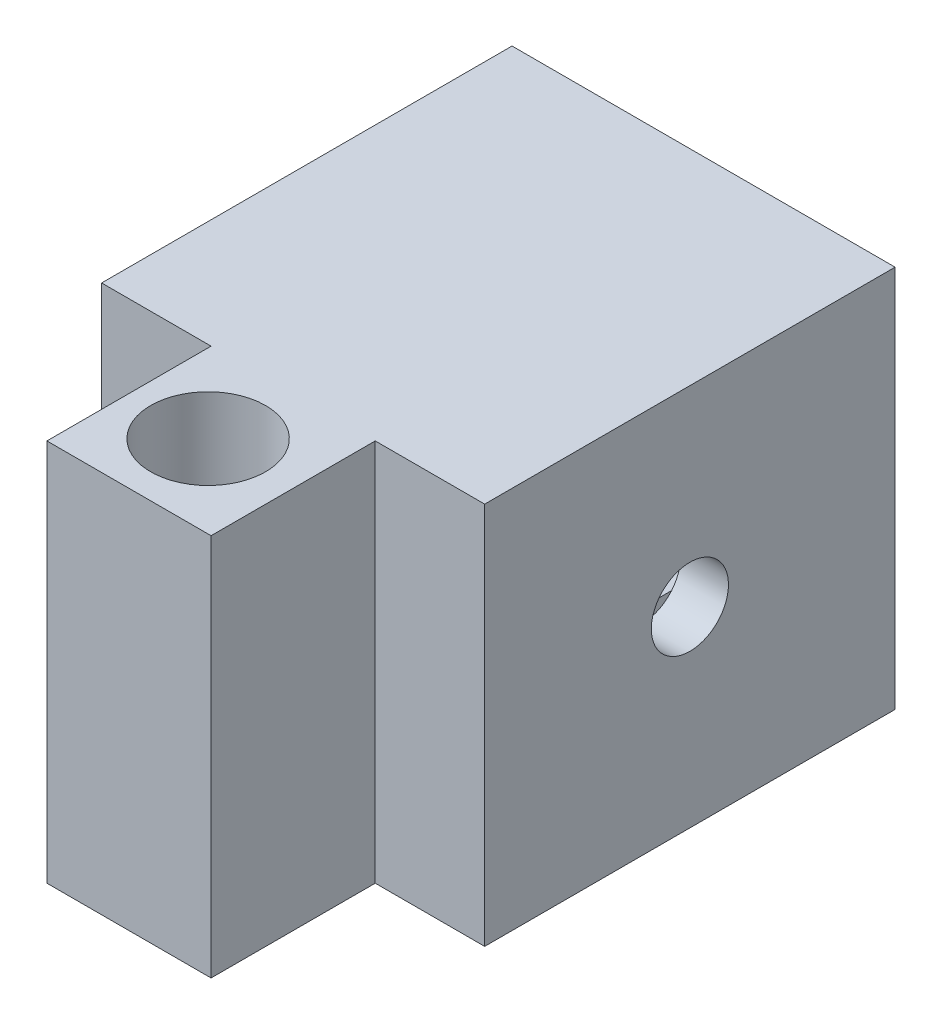
ISO-10303-21;
HEADER;
FILE_DESCRIPTION(('STEP AP214'),'2;1');
FILE_NAME('part.step','',(''),(''),'','','');
FILE_SCHEMA(('AUTOMOTIVE_DESIGN { 1 0 10303 214 1 1 1 1 }'));
ENDSEC;
DATA;
#1=APPLICATION_CONTEXT('core data for automotive mechanical design processes');
#2=APPLICATION_PROTOCOL_DEFINITION('international standard','automotive_design',2000,#1);
#3=PRODUCT_CONTEXT('',#1,'mechanical');
#4=PRODUCT('Part','Part','',(#3));
#5=PRODUCT_RELATED_PRODUCT_CATEGORY('part','',(#4));
#6=PRODUCT_DEFINITION_FORMATION('','',#4);
#7=PRODUCT_DEFINITION_CONTEXT('part definition',#1,'design');
#8=PRODUCT_DEFINITION('design','',#6,#7);
#9=PRODUCT_DEFINITION_SHAPE('','',#8);
#10=(LENGTH_UNIT() NAMED_UNIT(*) SI_UNIT(.MILLI.,.METRE.));
#11=(NAMED_UNIT(*) PLANE_ANGLE_UNIT() SI_UNIT($,.RADIAN.));
#12=(NAMED_UNIT(*) SI_UNIT($,.STERADIAN.) SOLID_ANGLE_UNIT());
#13=UNCERTAINTY_MEASURE_WITH_UNIT(LENGTH_MEASURE(1.E-05),#10,'distance_accuracy_value','');
#14=(GEOMETRIC_REPRESENTATION_CONTEXT(3) GLOBAL_UNCERTAINTY_ASSIGNED_CONTEXT((#13)) GLOBAL_UNIT_ASSIGNED_CONTEXT((#10,
#11,#12)) REPRESENTATION_CONTEXT('',''));
#15=CARTESIAN_POINT('',(0.,0.,0.));
#16=DIRECTION('',(0.,0.,1.));
#17=DIRECTION('',(1.,0.,0.));
#18=AXIS2_PLACEMENT_3D('',#15,#16,#17);
#19=CARTESIAN_POINT('',(0.,0.,0.));
#20=DIRECTION('',(0.,0.,1.));
#21=DIRECTION('',(1.,0.,0.));
#22=AXIS2_PLACEMENT_3D('',#19,#20,#21);
#23=PLANE('',#22);
#24=DIRECTION('',(1.,0.,0.));
#25=VECTOR('',#24,1.);
#26=CARTESIAN_POINT('',(0.,-14.,0.));
#27=LINE('',#26,#25);
#28=CARTESIAN_POINT('',(-14.,-14.,0.));
#29=VERTEX_POINT('',#28);
#30=CARTESIAN_POINT('',(-6.,-14.,0.));
#31=VERTEX_POINT('',#30);
#32=EDGE_CURVE('E69',#29,#31,#27,.T.);
#33=ORIENTED_EDGE('',*,*,#32,.T.);
#34=DIRECTION('',(0.,1.,0.));
#35=VECTOR('',#34,1.);
#36=CARTESIAN_POINT('',(-6.,-14.,0.));
#37=LINE('',#36,#35);
#38=CARTESIAN_POINT('',(-6.,14.,0.));
#39=VERTEX_POINT('',#38);
#40=EDGE_CURVE('E251',#31,#39,#37,.T.);
#41=ORIENTED_EDGE('',*,*,#40,.T.);
#42=DIRECTION('',(1.,0.,0.));
#43=VECTOR('',#42,1.);
#44=CARTESIAN_POINT('',(0.,14.,0.));
#45=LINE('',#44,#43);
#46=CARTESIAN_POINT('',(-14.,14.,0.));
#47=VERTEX_POINT('',#46);
#48=EDGE_CURVE('E302',#47,#39,#45,.T.);
#49=ORIENTED_EDGE('',*,*,#48,.F.);
#50=DIRECTION('',(0.,-1.,0.));
#51=VECTOR('',#50,1.);
#52=CARTESIAN_POINT('',(-14.,0.,0.));
#53=LINE('',#52,#51);
#54=EDGE_CURVE('E305',#47,#29,#53,.T.);
#55=ORIENTED_EDGE('',*,*,#54,.T.);
#56=EDGE_LOOP('',(#33,#41,#49,#55));
#57=FACE_BOUND('',#56,.T.);
#58=ADVANCED_FACE('F44',(#57),#23,.T.);
#59=CARTESIAN_POINT('',(-2.99327906455817,0.,-30.));
#60=DIRECTION('',(1.,0.,0.));
#61=DIRECTION('',(0.,1.,0.));
#62=AXIS2_PLACEMENT_3D('',#59,#60,#61);
#63=PLANE('',#62);
#64=DIRECTION('',(0.,1.,0.));
#65=VECTOR('',#64,1.);
#66=CARTESIAN_POINT('',(-2.99327906455817,0.,-5.));
#67=LINE('',#66,#65);
#68=CARTESIAN_POINT('',(-2.99327906455815,-10.5,-5.));
#69=VERTEX_POINT('',#68);
#70=CARTESIAN_POINT('',(-2.99327906455815,-8.8,-5.));
#71=VERTEX_POINT('',#70);
#72=EDGE_CURVE('E401',#69,#71,#67,.T.);
#73=ORIENTED_EDGE('',*,*,#72,.T.);
#74=DIRECTION('',(0.,0.,1.));
#75=VECTOR('',#74,1.);
#76=CARTESIAN_POINT('',(-2.99327906455815,-8.8,-30.));
#77=LINE('',#76,#75);
#78=CARTESIAN_POINT('',(-2.99327906455815,-8.8,-30.));
#79=VERTEX_POINT('',#78);
#80=EDGE_CURVE('E12',#79,#71,#77,.T.);
#81=ORIENTED_EDGE('',*,*,#80,.F.);
#82=DIRECTION('',(0.,1.,0.));
#83=VECTOR('',#82,1.);
#84=CARTESIAN_POINT('',(-2.99327906455817,0.,-30.));
#85=LINE('',#84,#83);
#86=CARTESIAN_POINT('',(-2.99327906455815,-10.5,-30.));
#87=VERTEX_POINT('',#86);
#88=EDGE_CURVE('E418',#87,#79,#85,.T.);
#89=ORIENTED_EDGE('',*,*,#88,.F.);
#90=DIRECTION('',(0.,0.,1.));
#91=VECTOR('',#90,1.);
#92=CARTESIAN_POINT('',(-2.99327906455815,-10.5,-30.));
#93=LINE('',#92,#91);
#94=EDGE_CURVE('E48',#87,#69,#93,.T.);
#95=ORIENTED_EDGE('',*,*,#94,.T.);
#96=EDGE_LOOP('',(#73,#81,#89,#95));
#97=FACE_BOUND('',#96,.T.);
#98=ADVANCED_FACE('F46',(#97),#63,.F.);
#99=CARTESIAN_POINT('',(0.,-8.8,-30.));
#100=DIRECTION('',(0.,1.,0.));
#101=DIRECTION('',(0.,0.,1.));
#102=AXIS2_PLACEMENT_3D('',#99,#100,#101);
#103=PLANE('',#102);
#104=DIRECTION('',(-1.,0.,0.));
#105=VECTOR('',#104,1.);
#106=CARTESIAN_POINT('',(0.,-8.8,-5.));
#107=LINE('',#106,#105);
#108=CARTESIAN_POINT('',(-4.4952478421969,-8.8,-5.));
#109=VERTEX_POINT('',#108);
#110=EDGE_CURVE('E404',#71,#109,#107,.T.);
#111=ORIENTED_EDGE('',*,*,#110,.T.);
#112=DIRECTION('',(0.,0.,1.));
#113=VECTOR('',#112,1.);
#114=CARTESIAN_POINT('',(-4.4952478421969,-8.8,-30.));
#115=LINE('',#114,#113);
#116=CARTESIAN_POINT('',(-4.4952478421969,-8.8,-30.));
#117=VERTEX_POINT('',#116);
#118=EDGE_CURVE('E53',#117,#109,#115,.T.);
#119=ORIENTED_EDGE('',*,*,#118,.F.);
#120=DIRECTION('',(-1.,0.,0.));
#121=VECTOR('',#120,1.);
#122=CARTESIAN_POINT('',(0.,-8.8,-30.));
#123=LINE('',#122,#121);
#124=EDGE_CURVE('E431',#79,#117,#123,.T.);
#125=ORIENTED_EDGE('',*,*,#124,.F.);
#126=ORIENTED_EDGE('',*,*,#80,.T.);
#127=EDGE_LOOP('',(#111,#119,#125,#126));
#128=FACE_BOUND('',#127,.T.);
#129=ADVANCED_FACE('F533',(#128),#103,.F.);
#130=CARTESIAN_POINT('',(-4.4952478421969,0.,-30.));
#131=DIRECTION('',(1.,0.,0.));
#132=DIRECTION('',(0.,0.,-1.));
#133=AXIS2_PLACEMENT_3D('',#130,#131,#132);
#134=PLANE('',#133);
#135=DIRECTION('',(0.,1.,0.));
#136=VECTOR('',#135,1.);
#137=CARTESIAN_POINT('',(-4.4952478421969,0.,-5.));
#138=LINE('',#137,#136);
#139=CARTESIAN_POINT('',(-4.4952478421969,-7.79987160701187,-5.));
#140=VERTEX_POINT('',#139);
#141=EDGE_CURVE('E406',#109,#140,#138,.T.);
#142=ORIENTED_EDGE('',*,*,#141,.T.);
#143=DIRECTION('',(0.,0.,1.));
#144=VECTOR('',#143,1.);
#145=CARTESIAN_POINT('',(-4.4952478421969,-7.79987160701187,-30.));
#146=LINE('',#145,#144);
#147=CARTESIAN_POINT('',(-4.4952478421969,-7.79987160701187,-30.));
#148=VERTEX_POINT('',#147);
#149=EDGE_CURVE('E435',#148,#140,#146,.T.);
#150=ORIENTED_EDGE('',*,*,#149,.F.);
#151=DIRECTION('',(0.,1.,0.));
#152=VECTOR('',#151,1.);
#153=CARTESIAN_POINT('',(-4.4952478421969,0.,-30.));
#154=LINE('',#153,#152);
#155=EDGE_CURVE('E429',#117,#148,#154,.T.);
#156=ORIENTED_EDGE('',*,*,#155,.F.);
#157=ORIENTED_EDGE('',*,*,#118,.T.);
#158=EDGE_LOOP('',(#142,#150,#156,#157));
#159=FACE_BOUND('',#158,.T.);
#160=ADVANCED_FACE('F530',(#159),#134,.F.);
#161=CARTESIAN_POINT('',(0.,-7.79987160701187,-30.));
#162=DIRECTION('',(0.,-1.,0.));
#163=DIRECTION('',(1.,0.,0.));
#164=AXIS2_PLACEMENT_3D('',#161,#162,#163);
#165=PLANE('',#164);
#166=DIRECTION('',(1.,0.,0.));
#167=VECTOR('',#166,1.);
#168=CARTESIAN_POINT('',(0.,-7.79987160701187,-5.));
#169=LINE('',#168,#167);
#170=CARTESIAN_POINT('',(4.50555441396361,-7.79987160701187,-5.));
#171=VERTEX_POINT('',#170);
#172=EDGE_CURVE('E408',#140,#171,#169,.T.);
#173=ORIENTED_EDGE('',*,*,#172,.T.);
#174=DIRECTION('',(0.,0.,1.));
#175=VECTOR('',#174,1.);
#176=CARTESIAN_POINT('',(4.50555441396361,-7.79987160701187,-30.));
#177=LINE('',#176,#175);
#178=CARTESIAN_POINT('',(4.50555441396361,-7.79987160701187,-30.));
#179=VERTEX_POINT('',#178);
#180=EDGE_CURVE('E438',#179,#171,#177,.T.);
#181=ORIENTED_EDGE('',*,*,#180,.F.);
#182=DIRECTION('',(1.,0.,0.));
#183=VECTOR('',#182,1.);
#184=CARTESIAN_POINT('',(0.,-7.79987160701187,-30.));
#185=LINE('',#184,#183);
#186=EDGE_CURVE('E427',#148,#179,#185,.T.);
#187=ORIENTED_EDGE('',*,*,#186,.F.);
#188=ORIENTED_EDGE('',*,*,#149,.T.);
#189=EDGE_LOOP('',(#173,#181,#187,#188));
#190=FACE_BOUND('',#189,.T.);
#191=ADVANCED_FACE('F525',(#190),#165,.F.);
#192=CARTESIAN_POINT('',(4.50555441396358,0.,-30.));
#193=DIRECTION('',(-1.,0.,0.));
#194=DIRECTION('',(0.,-1.,0.));
#195=AXIS2_PLACEMENT_3D('',#192,#193,#194);
#196=PLANE('',#195);
#197=DIRECTION('',(0.,-1.,0.));
#198=VECTOR('',#197,1.);
#199=CARTESIAN_POINT('',(4.50555441396358,0.,-5.));
#200=LINE('',#199,#198);
#201=CARTESIAN_POINT('',(4.50555441396361,-8.8,-5.));
#202=VERTEX_POINT('',#201);
#203=EDGE_CURVE('E410',#171,#202,#200,.T.);
#204=ORIENTED_EDGE('',*,*,#203,.T.);
#205=DIRECTION('',(0.,0.,1.));
#206=VECTOR('',#205,1.);
#207=CARTESIAN_POINT('',(4.50555441396361,-8.8,-30.));
#208=LINE('',#207,#206);
#209=CARTESIAN_POINT('',(4.50555441396361,-8.8,-30.));
#210=VERTEX_POINT('',#209);
#211=EDGE_CURVE('E441',#210,#202,#208,.T.);
#212=ORIENTED_EDGE('',*,*,#211,.F.);
#213=DIRECTION('',(0.,-1.,0.));
#214=VECTOR('',#213,1.);
#215=CARTESIAN_POINT('',(4.50555441396358,0.,-30.));
#216=LINE('',#215,#214);
#217=EDGE_CURVE('E425',#179,#210,#216,.T.);
#218=ORIENTED_EDGE('',*,*,#217,.F.);
#219=ORIENTED_EDGE('',*,*,#180,.T.);
#220=EDGE_LOOP('',(#204,#212,#218,#219));
#221=FACE_BOUND('',#220,.T.);
#222=ADVANCED_FACE('F521',(#221),#196,.F.);
#223=CARTESIAN_POINT('',(0.,-8.80000000000001,-30.));
#224=DIRECTION('',(0.,1.,0.));
#225=DIRECTION('',(-1.,0.,0.));
#226=AXIS2_PLACEMENT_3D('',#223,#224,#225);
#227=PLANE('',#226);
#228=DIRECTION('',(-1.,0.,0.));
#229=VECTOR('',#228,1.);
#230=CARTESIAN_POINT('',(0.,-8.80000000000001,-5.));
#231=LINE('',#230,#229);
#232=CARTESIAN_POINT('',(2.90672093544185,-8.8,-5.));
#233=VERTEX_POINT('',#232);
#234=EDGE_CURVE('E412',#202,#233,#231,.T.);
#235=ORIENTED_EDGE('',*,*,#234,.T.);
#236=DIRECTION('',(0.,0.,1.));
#237=VECTOR('',#236,1.);
#238=CARTESIAN_POINT('',(2.90672093544185,-8.8,-30.));
#239=LINE('',#238,#237);
#240=CARTESIAN_POINT('',(2.90672093544185,-8.8,-30.));
#241=VERTEX_POINT('',#240);
#242=EDGE_CURVE('E444',#241,#233,#239,.T.);
#243=ORIENTED_EDGE('',*,*,#242,.F.);
#244=DIRECTION('',(-1.,0.,0.));
#245=VECTOR('',#244,1.);
#246=CARTESIAN_POINT('',(0.,-8.80000000000001,-30.));
#247=LINE('',#246,#245);
#248=EDGE_CURVE('E423',#210,#241,#247,.T.);
#249=ORIENTED_EDGE('',*,*,#248,.F.);
#250=ORIENTED_EDGE('',*,*,#211,.T.);
#251=EDGE_LOOP('',(#235,#243,#249,#250));
#252=FACE_BOUND('',#251,.T.);
#253=ADVANCED_FACE('F517',(#252),#227,.F.);
#254=CARTESIAN_POINT('',(2.90672093544185,0.,-30.));
#255=DIRECTION('',(-1.,0.,0.));
#256=DIRECTION('',(0.,-1.,0.));
#257=AXIS2_PLACEMENT_3D('',#254,#255,#256);
#258=PLANE('',#257);
#259=DIRECTION('',(0.,-1.,0.));
#260=VECTOR('',#259,1.);
#261=CARTESIAN_POINT('',(2.90672093544185,0.,-5.));
#262=LINE('',#261,#260);
#263=CARTESIAN_POINT('',(2.90672093544185,-10.5,-5.));
#264=VERTEX_POINT('',#263);
#265=EDGE_CURVE('E414',#233,#264,#262,.T.);
#266=ORIENTED_EDGE('',*,*,#265,.T.);
#267=DIRECTION('',(0.,0.,1.));
#268=VECTOR('',#267,1.);
#269=CARTESIAN_POINT('',(2.90672093544185,-10.5,-30.));
#270=LINE('',#269,#268);
#271=CARTESIAN_POINT('',(2.90672093544185,-10.5,-30.));
#272=VERTEX_POINT('',#271);
#273=EDGE_CURVE('E446',#272,#264,#270,.T.);
#274=ORIENTED_EDGE('',*,*,#273,.F.);
#275=DIRECTION('',(0.,-1.,0.));
#276=VECTOR('',#275,1.);
#277=CARTESIAN_POINT('',(2.90672093544185,0.,-30.));
#278=LINE('',#277,#276);
#279=EDGE_CURVE('E421',#241,#272,#278,.T.);
#280=ORIENTED_EDGE('',*,*,#279,.F.);
#281=ORIENTED_EDGE('',*,*,#242,.T.);
#282=EDGE_LOOP('',(#266,#274,#280,#281));
#283=FACE_BOUND('',#282,.T.);
#284=ADVANCED_FACE('F512',(#283),#258,.F.);
#285=CARTESIAN_POINT('',(0.,0.,-30.));
#286=DIRECTION('',(0.,0.,1.));
#287=DIRECTION('',(1.,0.,0.));
#288=AXIS2_PLACEMENT_3D('',#285,#286,#287);
#289=PLANE('',#288);
#290=ORIENTED_EDGE('',*,*,#88,.T.);
#291=ORIENTED_EDGE('',*,*,#124,.T.);
#292=ORIENTED_EDGE('',*,*,#155,.T.);
#293=ORIENTED_EDGE('',*,*,#186,.T.);
#294=ORIENTED_EDGE('',*,*,#217,.T.);
#295=ORIENTED_EDGE('',*,*,#248,.T.);
#296=ORIENTED_EDGE('',*,*,#279,.T.);
#297=DIRECTION('',(-1.,0.,0.));
#298=VECTOR('',#297,1.);
#299=CARTESIAN_POINT('',(0.,-10.5,-30.));
#300=LINE('',#299,#298);
#301=CARTESIAN_POINT('',(10.5,-10.5,-30.));
#302=VERTEX_POINT('',#301);
#303=EDGE_CURVE('E295',#302,#272,#300,.T.);
#304=ORIENTED_EDGE('',*,*,#303,.F.);
#305=DIRECTION('',(0.,-1.,0.));
#306=VECTOR('',#305,1.);
#307=CARTESIAN_POINT('',(10.5,0.,-30.));
#308=LINE('',#307,#306);
#309=CARTESIAN_POINT('',(10.5,10.5,-30.));
#310=VERTEX_POINT('',#309);
#311=EDGE_CURVE('E291',#310,#302,#308,.T.);
#312=ORIENTED_EDGE('',*,*,#311,.F.);
#313=DIRECTION('',(-1.,0.,0.));
#314=VECTOR('',#313,1.);
#315=CARTESIAN_POINT('',(0.,10.5,-30.));
#316=LINE('',#315,#314);
#317=CARTESIAN_POINT('',(2.90672093544185,10.5,-30.));
#318=VERTEX_POINT('',#317);
#319=EDGE_CURVE('E288',#310,#318,#316,.T.);
#320=ORIENTED_EDGE('',*,*,#319,.T.);
#321=DIRECTION('',(0.,1.,0.));
#322=VECTOR('',#321,1.);
#323=CARTESIAN_POINT('',(2.90672093544185,0.,-30.));
#324=LINE('',#323,#322);
#325=CARTESIAN_POINT('',(2.90672093544185,8.8,-30.));
#326=VERTEX_POINT('',#325);
#327=EDGE_CURVE('E331',#326,#318,#324,.T.);
#328=ORIENTED_EDGE('',*,*,#327,.F.);
#329=DIRECTION('',(-1.,0.,0.));
#330=VECTOR('',#329,1.);
#331=CARTESIAN_POINT('',(0.,8.8,-30.));
#332=LINE('',#331,#330);
#333=CARTESIAN_POINT('',(4.50555441396361,8.8,-30.));
#334=VERTEX_POINT('',#333);
#335=EDGE_CURVE('E311',#334,#326,#332,.T.);
#336=ORIENTED_EDGE('',*,*,#335,.F.);
#337=DIRECTION('',(0.,1.,0.));
#338=VECTOR('',#337,1.);
#339=CARTESIAN_POINT('',(4.50555441396358,0.,-30.));
#340=LINE('',#339,#338);
#341=CARTESIAN_POINT('',(4.50555441396361,7.79987160701187,-30.));
#342=VERTEX_POINT('',#341);
#343=EDGE_CURVE('E345',#342,#334,#340,.T.);
#344=ORIENTED_EDGE('',*,*,#343,.F.);
#345=DIRECTION('',(1.,0.,0.));
#346=VECTOR('',#345,1.);
#347=CARTESIAN_POINT('',(0.,7.79987160701187,-30.));
#348=LINE('',#347,#346);
#349=CARTESIAN_POINT('',(-4.4952478421969,7.79987160701187,-30.));
#350=VERTEX_POINT('',#349);
#351=EDGE_CURVE('E342',#350,#342,#348,.T.);
#352=ORIENTED_EDGE('',*,*,#351,.F.);
#353=DIRECTION('',(0.,-1.,0.));
#354=VECTOR('',#353,1.);
#355=CARTESIAN_POINT('',(-4.4952478421969,0.,-30.));
#356=LINE('',#355,#354);
#357=CARTESIAN_POINT('',(-4.4952478421969,8.8,-30.));
#358=VERTEX_POINT('',#357);
#359=EDGE_CURVE('E339',#358,#350,#356,.T.);
#360=ORIENTED_EDGE('',*,*,#359,.F.);
#361=DIRECTION('',(-1.,0.,0.));
#362=VECTOR('',#361,1.);
#363=CARTESIAN_POINT('',(0.,8.8,-30.));
#364=LINE('',#363,#362);
#365=CARTESIAN_POINT('',(-2.99327906455815,8.8,-30.));
#366=VERTEX_POINT('',#365);
#367=EDGE_CURVE('E336',#366,#358,#364,.T.);
#368=ORIENTED_EDGE('',*,*,#367,.F.);
#369=DIRECTION('',(0.,-1.,0.));
#370=VECTOR('',#369,1.);
#371=CARTESIAN_POINT('',(-2.99327906455815,0.,-30.));
#372=LINE('',#371,#370);
#373=CARTESIAN_POINT('',(-2.99327906455815,10.5,-30.));
#374=VERTEX_POINT('',#373);
#375=EDGE_CURVE('E333',#374,#366,#372,.T.);
#376=ORIENTED_EDGE('',*,*,#375,.F.);
#377=CARTESIAN_POINT('',(-10.5,10.5,-30.));
#378=VERTEX_POINT('',#377);
#379=EDGE_CURVE('E287',#374,#378,#316,.T.);
#380=ORIENTED_EDGE('',*,*,#379,.T.);
#381=DIRECTION('',(0.,-1.,0.));
#382=VECTOR('',#381,1.);
#383=CARTESIAN_POINT('',(-10.5,0.,-30.));
#384=LINE('',#383,#382);
#385=CARTESIAN_POINT('',(-10.5,-10.5,-30.));
#386=VERTEX_POINT('',#385);
#387=EDGE_CURVE('E284',#378,#386,#384,.T.);
#388=ORIENTED_EDGE('',*,*,#387,.T.);
#389=EDGE_CURVE('E294',#87,#386,#300,.T.);
#390=ORIENTED_EDGE('',*,*,#389,.F.);
#391=EDGE_LOOP('',(#290,#291,#292,#293,#294,#295,#296,#304,#312,#320,#328,#336,#344,#352,#360,
#368,#376,#380,#388,#390));
#392=FACE_BOUND('',#391,.T.);
#393=DIRECTION('',(0.,-1.,0.));
#394=VECTOR('',#393,1.);
#395=CARTESIAN_POINT('',(14.,0.,-30.));
#396=LINE('',#395,#394);
#397=CARTESIAN_POINT('',(14.,14.,-30.));
#398=VERTEX_POINT('',#397);
#399=CARTESIAN_POINT('',(14.,-14.,-30.));
#400=VERTEX_POINT('',#399);
#401=EDGE_CURVE('E274',#398,#400,#396,.T.);
#402=ORIENTED_EDGE('',*,*,#401,.T.);
#403=DIRECTION('',(1.,0.,0.));
#404=VECTOR('',#403,1.);
#405=CARTESIAN_POINT('',(0.,-14.,-30.));
#406=LINE('',#405,#404);
#407=CARTESIAN_POINT('',(-14.,-14.,-30.));
#408=VERTEX_POINT('',#407);
#409=EDGE_CURVE('E281',#408,#400,#406,.T.);
#410=ORIENTED_EDGE('',*,*,#409,.F.);
#411=DIRECTION('',(0.,-1.,0.));
#412=VECTOR('',#411,1.);
#413=CARTESIAN_POINT('',(-14.,0.,-30.));
#414=LINE('',#413,#412);
#415=CARTESIAN_POINT('',(-14.,14.,-30.));
#416=VERTEX_POINT('',#415);
#417=EDGE_CURVE('E278',#416,#408,#414,.T.);
#418=ORIENTED_EDGE('',*,*,#417,.F.);
#419=DIRECTION('',(1.,0.,0.));
#420=VECTOR('',#419,1.);
#421=CARTESIAN_POINT('',(0.,14.,-30.));
#422=LINE('',#421,#420);
#423=EDGE_CURVE('E276',#416,#398,#422,.T.);
#424=ORIENTED_EDGE('',*,*,#423,.T.);
#425=EDGE_LOOP('',(#402,#410,#418,#424));
#426=FACE_BOUND('',#425,.T.);
#427=ADVANCED_FACE('F483',(#392,#426),#289,.F.);
#428=CARTESIAN_POINT('',(0.,0.,-5.));
#429=DIRECTION('',(0.,0.,1.));
#430=DIRECTION('',(1.,0.,0.));
#431=AXIS2_PLACEMENT_3D('',#428,#429,#430);
#432=PLANE('',#431);
#433=DIRECTION('',(0.,1.,0.));
#434=VECTOR('',#433,1.);
#435=CARTESIAN_POINT('',(2.90672093544185,0.,-5.));
#436=LINE('',#435,#434);
#437=CARTESIAN_POINT('',(2.90672093544185,8.8,-5.));
#438=VERTEX_POINT('',#437);
#439=CARTESIAN_POINT('',(2.90672093544185,10.5,-5.));
#440=VERTEX_POINT('',#439);
#441=EDGE_CURVE('E352',#438,#440,#436,.T.);
#442=ORIENTED_EDGE('',*,*,#441,.T.);
#443=DIRECTION('',(-1.,0.,0.));
#444=VECTOR('',#443,1.);
#445=CARTESIAN_POINT('',(0.,10.5,-5.));
#446=LINE('',#445,#444);
#447=CARTESIAN_POINT('',(10.5,10.5,-5.));
#448=VERTEX_POINT('',#447);
#449=EDGE_CURVE('E396',#448,#440,#446,.T.);
#450=ORIENTED_EDGE('',*,*,#449,.F.);
#451=DIRECTION('',(0.,-1.,0.));
#452=VECTOR('',#451,1.);
#453=CARTESIAN_POINT('',(10.5,0.,-5.));
#454=LINE('',#453,#452);
#455=CARTESIAN_POINT('',(10.5,-10.5,-5.));
#456=VERTEX_POINT('',#455);
#457=EDGE_CURVE('E416',#448,#456,#454,.T.);
#458=ORIENTED_EDGE('',*,*,#457,.T.);
#459=DIRECTION('',(-1.,0.,0.));
#460=VECTOR('',#459,1.);
#461=CARTESIAN_POINT('',(0.,-10.5,-5.));
#462=LINE('',#461,#460);
#463=EDGE_CURVE('E402',#456,#264,#462,.T.);
#464=ORIENTED_EDGE('',*,*,#463,.T.);
#465=ORIENTED_EDGE('',*,*,#265,.F.);
#466=ORIENTED_EDGE('',*,*,#234,.F.);
#467=ORIENTED_EDGE('',*,*,#203,.F.);
#468=ORIENTED_EDGE('',*,*,#172,.F.);
#469=ORIENTED_EDGE('',*,*,#141,.F.);
#470=ORIENTED_EDGE('',*,*,#110,.F.);
#471=ORIENTED_EDGE('',*,*,#72,.F.);
#472=CARTESIAN_POINT('',(-10.5,-10.5,-5.));
#473=VERTEX_POINT('',#472);
#474=EDGE_CURVE('E399',#69,#473,#462,.T.);
#475=ORIENTED_EDGE('',*,*,#474,.T.);
#476=DIRECTION('',(0.,-1.,0.));
#477=VECTOR('',#476,1.);
#478=CARTESIAN_POINT('',(-10.5,0.,-5.));
#479=LINE('',#478,#477);
#480=CARTESIAN_POINT('',(-10.5,10.5,-5.));
#481=VERTEX_POINT('',#480);
#482=EDGE_CURVE('E395',#481,#473,#479,.T.);
#483=ORIENTED_EDGE('',*,*,#482,.F.);
#484=CARTESIAN_POINT('',(-2.99327906455815,10.5,-5.));
#485=VERTEX_POINT('',#484);
#486=EDGE_CURVE('E392',#485,#481,#446,.T.);
#487=ORIENTED_EDGE('',*,*,#486,.F.);
#488=DIRECTION('',(0.,-1.,0.));
#489=VECTOR('',#488,1.);
#490=CARTESIAN_POINT('',(-2.99327906455815,0.,-5.));
#491=LINE('',#490,#489);
#492=CARTESIAN_POINT('',(-2.99327906455815,8.8,-5.));
#493=VERTEX_POINT('',#492);
#494=EDGE_CURVE('E389',#485,#493,#491,.T.);
#495=ORIENTED_EDGE('',*,*,#494,.T.);
#496=DIRECTION('',(-1.,0.,0.));
#497=VECTOR('',#496,1.);
#498=CARTESIAN_POINT('',(0.,8.8,-5.));
#499=LINE('',#498,#497);
#500=CARTESIAN_POINT('',(-4.4952478421969,8.8,-5.));
#501=VERTEX_POINT('',#500);
#502=EDGE_CURVE('E386',#493,#501,#499,.T.);
#503=ORIENTED_EDGE('',*,*,#502,.T.);
#504=DIRECTION('',(0.,-1.,0.));
#505=VECTOR('',#504,1.);
#506=CARTESIAN_POINT('',(-4.4952478421969,0.,-5.));
#507=LINE('',#506,#505);
#508=CARTESIAN_POINT('',(-4.4952478421969,7.79987160701187,-5.));
#509=VERTEX_POINT('',#508);
#510=EDGE_CURVE('E383',#501,#509,#507,.T.);
#511=ORIENTED_EDGE('',*,*,#510,.T.);
#512=DIRECTION('',(1.,0.,0.));
#513=VECTOR('',#512,1.);
#514=CARTESIAN_POINT('',(0.,7.79987160701187,-5.));
#515=LINE('',#514,#513);
#516=CARTESIAN_POINT('',(4.50555441396361,7.79987160701187,-5.));
#517=VERTEX_POINT('',#516);
#518=EDGE_CURVE('E380',#509,#517,#515,.T.);
#519=ORIENTED_EDGE('',*,*,#518,.T.);
#520=DIRECTION('',(0.,1.,0.));
#521=VECTOR('',#520,1.);
#522=CARTESIAN_POINT('',(4.50555441396358,0.,-5.));
#523=LINE('',#522,#521);
#524=CARTESIAN_POINT('',(4.50555441396361,8.8,-5.));
#525=VERTEX_POINT('',#524);
#526=EDGE_CURVE('E377',#517,#525,#523,.T.);
#527=ORIENTED_EDGE('',*,*,#526,.T.);
#528=DIRECTION('',(-1.,0.,0.));
#529=VECTOR('',#528,1.);
#530=CARTESIAN_POINT('',(0.,8.8,-5.));
#531=LINE('',#530,#529);
#532=EDGE_CURVE('E374',#525,#438,#531,.T.);
#533=ORIENTED_EDGE('',*,*,#532,.T.);
#534=EDGE_LOOP('',(#442,#450,#458,#464,#465,#466,#467,#468,#469,#470,#471,#475,#483,#487,#495,
#503,#511,#519,#527,#533));
#535=FACE_BOUND('',#534,.T.);
#536=ADVANCED_FACE('F460',(#535),#432,.F.);
#537=CARTESIAN_POINT('',(0.,8.8,-30.));
#538=DIRECTION('',(0.,1.,0.));
#539=DIRECTION('',(0.,0.,1.));
#540=AXIS2_PLACEMENT_3D('',#537,#538,#539);
#541=PLANE('',#540);
#542=ORIENTED_EDGE('',*,*,#532,.F.);
#543=DIRECTION('',(0.,0.,1.));
#544=VECTOR('',#543,1.);
#545=CARTESIAN_POINT('',(4.50555441396361,8.8,-30.));
#546=LINE('',#545,#544);
#547=EDGE_CURVE('E349',#334,#525,#546,.T.);
#548=ORIENTED_EDGE('',*,*,#547,.F.);
#549=ORIENTED_EDGE('',*,*,#335,.T.);
#550=DIRECTION('',(0.,0.,1.));
#551=VECTOR('',#550,1.);
#552=CARTESIAN_POINT('',(2.90672093544185,8.8,-30.));
#553=LINE('',#552,#551);
#554=EDGE_CURVE('E348',#326,#438,#553,.T.);
#555=ORIENTED_EDGE('',*,*,#554,.T.);
#556=EDGE_LOOP('',(#542,#548,#549,#555));
#557=FACE_BOUND('',#556,.T.);
#558=ADVANCED_FACE('F492',(#557),#541,.T.);
#559=CARTESIAN_POINT('',(4.50555441396358,0.,-30.));
#560=DIRECTION('',(1.,0.,0.));
#561=DIRECTION('',(0.,1.,0.));
#562=AXIS2_PLACEMENT_3D('',#559,#560,#561);
#563=PLANE('',#562);
#564=ORIENTED_EDGE('',*,*,#526,.F.);
#565=DIRECTION('',(0.,0.,1.));
#566=VECTOR('',#565,1.);
#567=CARTESIAN_POINT('',(4.50555441396361,7.79987160701187,-30.));
#568=LINE('',#567,#566);
#569=EDGE_CURVE('E353',#342,#517,#568,.T.);
#570=ORIENTED_EDGE('',*,*,#569,.F.);
#571=ORIENTED_EDGE('',*,*,#343,.T.);
#572=ORIENTED_EDGE('',*,*,#547,.T.);
#573=EDGE_LOOP('',(#564,#570,#571,#572));
#574=FACE_BOUND('',#573,.T.);
#575=ADVANCED_FACE('F490',(#574),#563,.T.);
#576=CARTESIAN_POINT('',(0.,7.79987160701187,-30.));
#577=DIRECTION('',(0.,-1.,0.));
#578=DIRECTION('',(0.,0.,-1.));
#579=AXIS2_PLACEMENT_3D('',#576,#577,#578);
#580=PLANE('',#579);
#581=ORIENTED_EDGE('',*,*,#518,.F.);
#582=DIRECTION('',(0.,0.,1.));
#583=VECTOR('',#582,1.);
#584=CARTESIAN_POINT('',(-4.4952478421969,7.79987160701187,-30.));
#585=LINE('',#584,#583);
#586=EDGE_CURVE('E356',#350,#509,#585,.T.);
#587=ORIENTED_EDGE('',*,*,#586,.F.);
#588=ORIENTED_EDGE('',*,*,#351,.T.);
#589=ORIENTED_EDGE('',*,*,#569,.T.);
#590=EDGE_LOOP('',(#581,#587,#588,#589));
#591=FACE_BOUND('',#590,.T.);
#592=ADVANCED_FACE('F488',(#591),#580,.T.);
#593=CARTESIAN_POINT('',(-4.4952478421969,0.,-30.));
#594=DIRECTION('',(-1.,0.,0.));
#595=DIRECTION('',(0.,0.,1.));
#596=AXIS2_PLACEMENT_3D('',#593,#594,#595);
#597=PLANE('',#596);
#598=ORIENTED_EDGE('',*,*,#510,.F.);
#599=DIRECTION('',(0.,0.,1.));
#600=VECTOR('',#599,1.);
#601=CARTESIAN_POINT('',(-4.4952478421969,8.8,-30.));
#602=LINE('',#601,#600);
#603=EDGE_CURVE('E359',#358,#501,#602,.T.);
#604=ORIENTED_EDGE('',*,*,#603,.F.);
#605=ORIENTED_EDGE('',*,*,#359,.T.);
#606=ORIENTED_EDGE('',*,*,#586,.T.);
#607=EDGE_LOOP('',(#598,#604,#605,#606));
#608=FACE_BOUND('',#607,.T.);
#609=ADVANCED_FACE('F480',(#608),#597,.T.);
#610=CARTESIAN_POINT('',(0.,8.8,-30.));
#611=DIRECTION('',(0.,1.,0.));
#612=DIRECTION('',(0.,0.,1.));
#613=AXIS2_PLACEMENT_3D('',#610,#611,#612);
#614=PLANE('',#613);
#615=ORIENTED_EDGE('',*,*,#502,.F.);
#616=DIRECTION('',(0.,0.,1.));
#617=VECTOR('',#616,1.);
#618=CARTESIAN_POINT('',(-2.99327906455815,8.8,-30.));
#619=LINE('',#618,#617);
#620=EDGE_CURVE('E362',#366,#493,#619,.T.);
#621=ORIENTED_EDGE('',*,*,#620,.F.);
#622=ORIENTED_EDGE('',*,*,#367,.T.);
#623=ORIENTED_EDGE('',*,*,#603,.T.);
#624=EDGE_LOOP('',(#615,#621,#622,#623));
#625=FACE_BOUND('',#624,.T.);
#626=ADVANCED_FACE('F476',(#625),#614,.T.);
#627=CARTESIAN_POINT('',(-2.99327906455815,0.,-30.));
#628=DIRECTION('',(-1.,0.,0.));
#629=DIRECTION('',(0.,0.,1.));
#630=AXIS2_PLACEMENT_3D('',#627,#628,#629);
#631=PLANE('',#630);
#632=ORIENTED_EDGE('',*,*,#494,.F.);
#633=DIRECTION('',(0.,0.,1.));
#634=VECTOR('',#633,1.);
#635=CARTESIAN_POINT('',(-2.99327906455815,10.5,-30.));
#636=LINE('',#635,#634);
#637=EDGE_CURVE('E365',#374,#485,#636,.T.);
#638=ORIENTED_EDGE('',*,*,#637,.F.);
#639=ORIENTED_EDGE('',*,*,#375,.T.);
#640=ORIENTED_EDGE('',*,*,#620,.T.);
#641=EDGE_LOOP('',(#632,#638,#639,#640));
#642=FACE_BOUND('',#641,.T.);
#643=ADVANCED_FACE('F474',(#642),#631,.T.);
#644=CARTESIAN_POINT('',(2.90672093544185,0.,-30.));
#645=DIRECTION('',(1.,0.,0.));
#646=DIRECTION('',(0.,0.,-1.));
#647=AXIS2_PLACEMENT_3D('',#644,#645,#646);
#648=PLANE('',#647);
#649=ORIENTED_EDGE('',*,*,#441,.F.);
#650=ORIENTED_EDGE('',*,*,#554,.F.);
#651=ORIENTED_EDGE('',*,*,#327,.T.);
#652=DIRECTION('',(0.,0.,1.));
#653=VECTOR('',#652,1.);
#654=CARTESIAN_POINT('',(2.90672093544185,10.5,-30.));
#655=LINE('',#654,#653);
#656=EDGE_CURVE('E368',#318,#440,#655,.T.);
#657=ORIENTED_EDGE('',*,*,#656,.T.);
#658=EDGE_LOOP('',(#649,#650,#651,#657));
#659=FACE_BOUND('',#658,.T.);
#660=ADVANCED_FACE('F498',(#659),#648,.T.);
#661=CARTESIAN_POINT('',(-10.5,0.,-30.));
#662=DIRECTION('',(-1.,0.,0.));
#663=DIRECTION('',(0.,-1.,0.));
#664=AXIS2_PLACEMENT_3D('',#661,#662,#663);
#665=PLANE('',#664);
#666=CARTESIAN_POINT('',(-10.5,0.,-15.));
#667=DIRECTION('',(-1.,0.,0.));
#668=DIRECTION('',(0.,-1.,0.));
#669=AXIS2_PLACEMENT_3D('',#666,#667,#668);
#670=CIRCLE('',#669,2.82);
#671=CARTESIAN_POINT('',(-10.5,-2.82,-15.));
#672=VERTEX_POINT('',#671);
#673=EDGE_CURVE('E270',#672,#672,#670,.T.);
#674=ORIENTED_EDGE('',*,*,#673,.T.);
#675=EDGE_LOOP('',(#674));
#676=FACE_BOUND('',#675,.T.);
#677=DIRECTION('',(0.,0.,1.));
#678=VECTOR('',#677,1.);
#679=CARTESIAN_POINT('',(-10.5,10.5,-30.));
#680=LINE('',#679,#678);
#681=EDGE_CURVE('E318',#378,#481,#680,.T.);
#682=ORIENTED_EDGE('',*,*,#681,.T.);
#683=ORIENTED_EDGE('',*,*,#482,.T.);
#684=DIRECTION('',(0.,0.,1.));
#685=VECTOR('',#684,1.);
#686=CARTESIAN_POINT('',(-10.5,-10.5,-30.));
#687=LINE('',#686,#685);
#688=EDGE_CURVE('E308',#386,#473,#687,.T.);
#689=ORIENTED_EDGE('',*,*,#688,.F.);
#690=ORIENTED_EDGE('',*,*,#387,.F.);
#691=EDGE_LOOP('',(#682,#683,#689,#690));
#692=FACE_BOUND('',#691,.T.);
#693=ADVANCED_FACE('F466',(#676,#692),#665,.F.);
#694=CARTESIAN_POINT('',(0.,-10.5,-30.));
#695=DIRECTION('',(0.,1.,0.));
#696=DIRECTION('',(-1.,0.,0.));
#697=AXIS2_PLACEMENT_3D('',#694,#695,#696);
#698=PLANE('',#697);
#699=ORIENTED_EDGE('',*,*,#273,.T.);
#700=ORIENTED_EDGE('',*,*,#463,.F.);
#701=DIRECTION('',(0.,0.,1.));
#702=VECTOR('',#701,1.);
#703=CARTESIAN_POINT('',(10.5,-10.5,-30.));
#704=LINE('',#703,#702);
#705=EDGE_CURVE('E312',#302,#456,#704,.T.);
#706=ORIENTED_EDGE('',*,*,#705,.F.);
#707=ORIENTED_EDGE('',*,*,#303,.T.);
#708=EDGE_LOOP('',(#699,#700,#706,#707));
#709=FACE_BOUND('',#708,.T.);
#710=ADVANCED_FACE('F507',(#709),#698,.T.);
#711=ORIENTED_EDGE('',*,*,#94,.F.);
#712=ORIENTED_EDGE('',*,*,#389,.T.);
#713=ORIENTED_EDGE('',*,*,#688,.T.);
#714=ORIENTED_EDGE('',*,*,#474,.F.);
#715=EDGE_LOOP('',(#711,#712,#713,#714));
#716=FACE_BOUND('',#715,.T.);
#717=ADVANCED_FACE('F462',(#716),#698,.T.);
#718=CARTESIAN_POINT('',(10.5,0.,-30.));
#719=DIRECTION('',(-1.,0.,0.));
#720=DIRECTION('',(0.,-1.,0.));
#721=AXIS2_PLACEMENT_3D('',#718,#719,#720);
#722=PLANE('',#721);
#723=CARTESIAN_POINT('',(10.5,0.,-15.));
#724=DIRECTION('',(-1.,0.,0.));
#725=DIRECTION('',(0.,-1.,0.));
#726=AXIS2_PLACEMENT_3D('',#723,#724,#725);
#727=CIRCLE('',#726,2.82);
#728=CARTESIAN_POINT('',(10.5,-2.82,-15.));
#729=VERTEX_POINT('',#728);
#730=EDGE_CURVE('E266',#729,#729,#727,.T.);
#731=ORIENTED_EDGE('',*,*,#730,.F.);
#732=EDGE_LOOP('',(#731));
#733=FACE_BOUND('',#732,.T.);
#734=ORIENTED_EDGE('',*,*,#457,.F.);
#735=DIRECTION('',(0.,0.,1.));
#736=VECTOR('',#735,1.);
#737=CARTESIAN_POINT('',(10.5,10.5,-30.));
#738=LINE('',#737,#736);
#739=EDGE_CURVE('E315',#310,#448,#738,.T.);
#740=ORIENTED_EDGE('',*,*,#739,.F.);
#741=ORIENTED_EDGE('',*,*,#311,.T.);
#742=ORIENTED_EDGE('',*,*,#705,.T.);
#743=EDGE_LOOP('',(#734,#740,#741,#742));
#744=FACE_BOUND('',#743,.T.);
#745=ADVANCED_FACE('F505',(#733,#744),#722,.T.);
#746=CARTESIAN_POINT('',(0.,10.5,-30.));
#747=DIRECTION('',(0.,1.,0.));
#748=DIRECTION('',(-1.,0.,0.));
#749=AXIS2_PLACEMENT_3D('',#746,#747,#748);
#750=PLANE('',#749);
#751=ORIENTED_EDGE('',*,*,#637,.T.);
#752=ORIENTED_EDGE('',*,*,#486,.T.);
#753=ORIENTED_EDGE('',*,*,#681,.F.);
#754=ORIENTED_EDGE('',*,*,#379,.F.);
#755=EDGE_LOOP('',(#751,#752,#753,#754));
#756=FACE_BOUND('',#755,.T.);
#757=ADVANCED_FACE('F470',(#756),#750,.F.);
#758=ORIENTED_EDGE('',*,*,#739,.T.);
#759=ORIENTED_EDGE('',*,*,#449,.T.);
#760=ORIENTED_EDGE('',*,*,#656,.F.);
#761=ORIENTED_EDGE('',*,*,#319,.F.);
#762=EDGE_LOOP('',(#758,#759,#760,#761));
#763=FACE_BOUND('',#762,.T.);
#764=ADVANCED_FACE('F501',(#763),#750,.F.);
#765=CARTESIAN_POINT('',(14.,0.,-30.));
#766=DIRECTION('',(-1.,0.,0.));
#767=DIRECTION('',(0.,-1.,0.));
#768=AXIS2_PLACEMENT_3D('',#765,#766,#767);
#769=PLANE('',#768);
#770=CARTESIAN_POINT('',(14.,0.,-15.));
#771=DIRECTION('',(-1.,0.,0.));
#772=DIRECTION('',(0.,-1.,0.));
#773=AXIS2_PLACEMENT_3D('',#770,#771,#772);
#774=CIRCLE('',#773,2.82);
#775=CARTESIAN_POINT('',(14.,-2.82,-15.));
#776=VERTEX_POINT('',#775);
#777=EDGE_CURVE('E259',#776,#776,#774,.T.);
#778=ORIENTED_EDGE('',*,*,#777,.T.);
#779=EDGE_LOOP('',(#778));
#780=FACE_BOUND('',#779,.T.);
#781=DIRECTION('',(0.,-1.,0.));
#782=VECTOR('',#781,1.);
#783=CARTESIAN_POINT('',(14.,0.,0.));
#784=LINE('',#783,#782);
#785=CARTESIAN_POINT('',(14.,14.,0.));
#786=VERTEX_POINT('',#785);
#787=CARTESIAN_POINT('',(14.,-14.,0.));
#788=VERTEX_POINT('',#787);
#789=EDGE_CURVE('E273',#786,#788,#784,.T.);
#790=ORIENTED_EDGE('',*,*,#789,.T.);
#791=DIRECTION('',(0.,0.,1.));
#792=VECTOR('',#791,1.);
#793=CARTESIAN_POINT('',(14.,-14.,-30.));
#794=LINE('',#793,#792);
#795=EDGE_CURVE('E321',#400,#788,#794,.T.);
#796=ORIENTED_EDGE('',*,*,#795,.F.);
#797=ORIENTED_EDGE('',*,*,#401,.F.);
#798=DIRECTION('',(0.,0.,1.));
#799=VECTOR('',#798,1.);
#800=CARTESIAN_POINT('',(14.,14.,-30.));
#801=LINE('',#800,#799);
#802=EDGE_CURVE('E298',#398,#786,#801,.T.);
#803=ORIENTED_EDGE('',*,*,#802,.T.);
#804=EDGE_LOOP('',(#790,#796,#797,#803));
#805=FACE_BOUND('',#804,.T.);
#806=ADVANCED_FACE('F569',(#780,#805),#769,.F.);
#807=CARTESIAN_POINT('',(0.,-14.,-30.));
#808=DIRECTION('',(0.,-1.,0.));
#809=DIRECTION('',(0.,0.,-1.));
#810=AXIS2_PLACEMENT_3D('',#807,#808,#809);
#811=PLANE('',#810);
#812=CARTESIAN_POINT('',(-0.251999230982847,-14.,5.96456479330243));
#813=DIRECTION('',(0.,-1.,0.));
#814=DIRECTION('',(0.,0.,-1.));
#815=AXIS2_PLACEMENT_3D('',#812,#813,#814);
#816=CIRCLE('',#815,4.2);
#817=CARTESIAN_POINT('',(-0.251999230982847,-14.,1.76456479330243));
#818=VERTEX_POINT('',#817);
#819=EDGE_CURVE('E825',#818,#818,#816,.T.);
#820=ORIENTED_EDGE('',*,*,#819,.F.);
#821=EDGE_LOOP('',(#820));
#822=FACE_BOUND('',#821,.T.);
#823=ORIENTED_EDGE('',*,*,#32,.F.);
#824=DIRECTION('',(0.,0.,1.));
#825=VECTOR('',#824,1.);
#826=CARTESIAN_POINT('',(-14.,-14.,-30.));
#827=LINE('',#826,#825);
#828=EDGE_CURVE('E323',#408,#29,#827,.T.);
#829=ORIENTED_EDGE('',*,*,#828,.F.);
#830=ORIENTED_EDGE('',*,*,#409,.T.);
#831=ORIENTED_EDGE('',*,*,#795,.T.);
#832=CARTESIAN_POINT('',(6.,-14.,0.));
#833=VERTEX_POINT('',#832);
#834=EDGE_CURVE('E255',#833,#788,#27,.T.);
#835=ORIENTED_EDGE('',*,*,#834,.F.);
#836=DIRECTION('',(0.,0.,-1.));
#837=VECTOR('',#836,1.);
#838=CARTESIAN_POINT('',(6.,-14.,12.));
#839=LINE('',#838,#837);
#840=CARTESIAN_POINT('',(6.,-14.,12.));
#841=VERTEX_POINT('',#840);
#842=EDGE_CURVE('E236',#841,#833,#839,.T.);
#843=ORIENTED_EDGE('',*,*,#842,.F.);
#844=DIRECTION('',(1.,0.,0.));
#845=VECTOR('',#844,1.);
#846=CARTESIAN_POINT('',(-6.,-14.,12.));
#847=LINE('',#846,#845);
#848=CARTESIAN_POINT('',(-6.,-14.,12.));
#849=VERTEX_POINT('',#848);
#850=EDGE_CURVE('E243',#849,#841,#847,.T.);
#851=ORIENTED_EDGE('',*,*,#850,.F.);
#852=DIRECTION('',(0.,0.,-1.));
#853=VECTOR('',#852,1.);
#854=CARTESIAN_POINT('',(-6.,-14.,12.));
#855=LINE('',#854,#853);
#856=EDGE_CURVE('E831',#849,#31,#855,.T.);
#857=ORIENTED_EDGE('',*,*,#856,.T.);
#858=EDGE_LOOP('',(#823,#829,#830,#831,#835,#843,#851,#857));
#859=FACE_BOUND('',#858,.T.);
#860=ADVANCED_FACE('F253',(#822,#859),#811,.T.);
#861=CARTESIAN_POINT('',(-14.,0.,-30.));
#862=DIRECTION('',(-1.,0.,0.));
#863=DIRECTION('',(0.,-1.,0.));
#864=AXIS2_PLACEMENT_3D('',#861,#862,#863);
#865=PLANE('',#864);
#866=CARTESIAN_POINT('',(-14.,0.,-15.));
#867=DIRECTION('',(-1.,0.,0.));
#868=DIRECTION('',(0.,-1.,0.));
#869=AXIS2_PLACEMENT_3D('',#866,#867,#868);
#870=CIRCLE('',#869,2.82);
#871=CARTESIAN_POINT('',(-14.,-2.82,-15.));
#872=VERTEX_POINT('',#871);
#873=EDGE_CURVE('E256',#872,#872,#870,.T.);
#874=ORIENTED_EDGE('',*,*,#873,.F.);
#875=EDGE_LOOP('',(#874));
#876=FACE_BOUND('',#875,.T.);
#877=ORIENTED_EDGE('',*,*,#54,.F.);
#878=DIRECTION('',(0.,0.,1.));
#879=VECTOR('',#878,1.);
#880=CARTESIAN_POINT('',(-14.,14.,-30.));
#881=LINE('',#880,#879);
#882=EDGE_CURVE('E325',#416,#47,#881,.T.);
#883=ORIENTED_EDGE('',*,*,#882,.F.);
#884=ORIENTED_EDGE('',*,*,#417,.T.);
#885=ORIENTED_EDGE('',*,*,#828,.T.);
#886=EDGE_LOOP('',(#877,#883,#884,#885));
#887=FACE_BOUND('',#886,.T.);
#888=ADVANCED_FACE('F557',(#876,#887),#865,.T.);
#889=CARTESIAN_POINT('',(0.,14.,-30.));
#890=DIRECTION('',(0.,-1.,0.));
#891=DIRECTION('',(0.,0.,-1.));
#892=AXIS2_PLACEMENT_3D('',#889,#890,#891);
#893=PLANE('',#892);
#894=CARTESIAN_POINT('',(-0.251999230982847,14.,5.96456479330243));
#895=DIRECTION('',(0.,-1.,0.));
#896=DIRECTION('',(0.,0.,-1.));
#897=AXIS2_PLACEMENT_3D('',#894,#895,#896);
#898=CIRCLE('',#897,4.2);
#899=CARTESIAN_POINT('',(-0.251999230982847,14.,1.76456479330243));
#900=VERTEX_POINT('',#899);
#901=EDGE_CURVE('E822',#900,#900,#898,.T.);
#902=ORIENTED_EDGE('',*,*,#901,.T.);
#903=EDGE_LOOP('',(#902));
#904=FACE_BOUND('',#903,.T.);
#905=ORIENTED_EDGE('',*,*,#48,.T.);
#906=DIRECTION('',(0.,0.,-1.));
#907=VECTOR('',#906,1.);
#908=CARTESIAN_POINT('',(-6.,14.,12.));
#909=LINE('',#908,#907);
#910=CARTESIAN_POINT('',(-6.,14.,12.));
#911=VERTEX_POINT('',#910);
#912=EDGE_CURVE('E261',#911,#39,#909,.T.);
#913=ORIENTED_EDGE('',*,*,#912,.F.);
#914=DIRECTION('',(1.,0.,0.));
#915=VECTOR('',#914,1.);
#916=CARTESIAN_POINT('',(-6.,14.,12.));
#917=LINE('',#916,#915);
#918=CARTESIAN_POINT('',(6.,14.,12.));
#919=VERTEX_POINT('',#918);
#920=EDGE_CURVE('E242',#911,#919,#917,.T.);
#921=ORIENTED_EDGE('',*,*,#920,.T.);
#922=DIRECTION('',(0.,0.,-1.));
#923=VECTOR('',#922,1.);
#924=CARTESIAN_POINT('',(6.,14.,12.));
#925=LINE('',#924,#923);
#926=CARTESIAN_POINT('',(6.,14.,0.));
#927=VERTEX_POINT('',#926);
#928=EDGE_CURVE('E238',#919,#927,#925,.T.);
#929=ORIENTED_EDGE('',*,*,#928,.T.);
#930=EDGE_CURVE('E301',#927,#786,#45,.T.);
#931=ORIENTED_EDGE('',*,*,#930,.T.);
#932=ORIENTED_EDGE('',*,*,#802,.F.);
#933=ORIENTED_EDGE('',*,*,#423,.F.);
#934=ORIENTED_EDGE('',*,*,#882,.T.);
#935=EDGE_LOOP('',(#905,#913,#921,#929,#931,#932,#933,#934));
#936=FACE_BOUND('',#935,.T.);
#937=ADVANCED_FACE('F549',(#904,#936),#893,.F.);
#938=DIRECTION('',(0.,1.,0.));
#939=VECTOR('',#938,1.);
#940=CARTESIAN_POINT('',(6.,-14.,0.));
#941=LINE('',#940,#939);
#942=EDGE_CURVE('E61',#833,#927,#941,.T.);
#943=ORIENTED_EDGE('',*,*,#942,.F.);
#944=ORIENTED_EDGE('',*,*,#834,.T.);
#945=ORIENTED_EDGE('',*,*,#789,.F.);
#946=ORIENTED_EDGE('',*,*,#930,.F.);
#947=EDGE_LOOP('',(#943,#944,#945,#946));
#948=FACE_BOUND('',#947,.T.);
#949=ADVANCED_FACE('F543',(#948),#23,.T.);
#950=CARTESIAN_POINT('',(14.,0.,-15.));
#951=DIRECTION('',(-1.,0.,0.));
#952=DIRECTION('',(0.,-1.,0.));
#953=AXIS2_PLACEMENT_3D('',#950,#951,#952);
#954=CYLINDRICAL_SURFACE('',#953,2.82);
#955=ORIENTED_EDGE('',*,*,#873,.T.);
#956=EDGE_LOOP('',(#955));
#957=FACE_BOUND('',#956,.T.);
#958=ORIENTED_EDGE('',*,*,#673,.F.);
#959=EDGE_LOOP('',(#958));
#960=FACE_BOUND('',#959,.T.);
#961=ADVANCED_FACE('F548',(#957,#960),#954,.F.);
#962=ORIENTED_EDGE('',*,*,#730,.T.);
#963=EDGE_LOOP('',(#962));
#964=FACE_BOUND('',#963,.T.);
#965=ORIENTED_EDGE('',*,*,#777,.F.);
#966=EDGE_LOOP('',(#965));
#967=FACE_BOUND('',#966,.T.);
#968=ADVANCED_FACE('F554',(#964,#967),#954,.F.);
#969=CARTESIAN_POINT('',(6.,-14.,12.));
#970=DIRECTION('',(-1.,0.,0.));
#971=DIRECTION('',(0.,0.,1.));
#972=AXIS2_PLACEMENT_3D('',#969,#970,#971);
#973=PLANE('',#972);
#974=ORIENTED_EDGE('',*,*,#942,.T.);
#975=ORIENTED_EDGE('',*,*,#928,.F.);
#976=DIRECTION('',(0.,1.,0.));
#977=VECTOR('',#976,1.);
#978=CARTESIAN_POINT('',(6.,-14.,12.));
#979=LINE('',#978,#977);
#980=EDGE_CURVE('E232',#841,#919,#979,.T.);
#981=ORIENTED_EDGE('',*,*,#980,.F.);
#982=ORIENTED_EDGE('',*,*,#842,.T.);
#983=EDGE_LOOP('',(#974,#975,#981,#982));
#984=FACE_BOUND('',#983,.T.);
#985=ADVANCED_FACE('F234',(#984),#973,.F.);
#986=CARTESIAN_POINT('',(-6.,-14.,12.));
#987=DIRECTION('',(-1.,0.,0.));
#988=DIRECTION('',(0.,0.,1.));
#989=AXIS2_PLACEMENT_3D('',#986,#987,#988);
#990=PLANE('',#989);
#991=ORIENTED_EDGE('',*,*,#40,.F.);
#992=ORIENTED_EDGE('',*,*,#856,.F.);
#993=DIRECTION('',(0.,1.,0.));
#994=VECTOR('',#993,1.);
#995=CARTESIAN_POINT('',(-6.,-14.,12.));
#996=LINE('',#995,#994);
#997=EDGE_CURVE('E249',#849,#911,#996,.T.);
#998=ORIENTED_EDGE('',*,*,#997,.T.);
#999=ORIENTED_EDGE('',*,*,#912,.T.);
#1000=EDGE_LOOP('',(#991,#992,#998,#999));
#1001=FACE_BOUND('',#1000,.T.);
#1002=ADVANCED_FACE('F779',(#1001),#990,.T.);
#1003=CARTESIAN_POINT('',(0.,0.,12.));
#1004=DIRECTION('',(0.,0.,1.));
#1005=DIRECTION('',(1.,0.,0.));
#1006=AXIS2_PLACEMENT_3D('',#1003,#1004,#1005);
#1007=PLANE('',#1006);
#1008=ORIENTED_EDGE('',*,*,#850,.T.);
#1009=ORIENTED_EDGE('',*,*,#980,.T.);
#1010=ORIENTED_EDGE('',*,*,#920,.F.);
#1011=ORIENTED_EDGE('',*,*,#997,.F.);
#1012=EDGE_LOOP('',(#1008,#1009,#1010,#1011));
#1013=FACE_BOUND('',#1012,.T.);
#1014=ADVANCED_FACE('F247',(#1013),#1007,.T.);
#1015=CARTESIAN_POINT('',(-0.251999230982847,14.,5.96456479330243));
#1016=DIRECTION('',(0.,-1.,0.));
#1017=DIRECTION('',(0.,0.,-1.));
#1018=AXIS2_PLACEMENT_3D('',#1015,#1016,#1017);
#1019=CYLINDRICAL_SURFACE('',#1018,4.2);
#1020=ORIENTED_EDGE('',*,*,#901,.F.);
#1021=EDGE_LOOP('',(#1020));
#1022=FACE_BOUND('',#1021,.T.);
#1023=ORIENTED_EDGE('',*,*,#819,.T.);
#1024=EDGE_LOOP('',(#1023));
#1025=FACE_BOUND('',#1024,.T.);
#1026=ADVANCED_FACE('F798',(#1022,#1025),#1019,.F.);
#1027=CLOSED_SHELL('',(#58,#98,#129,#160,#191,#222,#253,#284,#427,#536,#558,#575,#592,#609,#626,
#643,#660,#693,#710,#717,#745,#757,#764,#806,#860,#888,#937,#949,#961,#968,#985,#1002,#1014,#1026));
#1028=MANIFOLD_SOLID_BREP('B2',#1027);
#1029=ADVANCED_BREP_SHAPE_REPRESENTATION('',(#18,#1028),#14);
#1030=SHAPE_DEFINITION_REPRESENTATION(#9,#1029);
ENDSEC;
END-ISO-10303-21;
